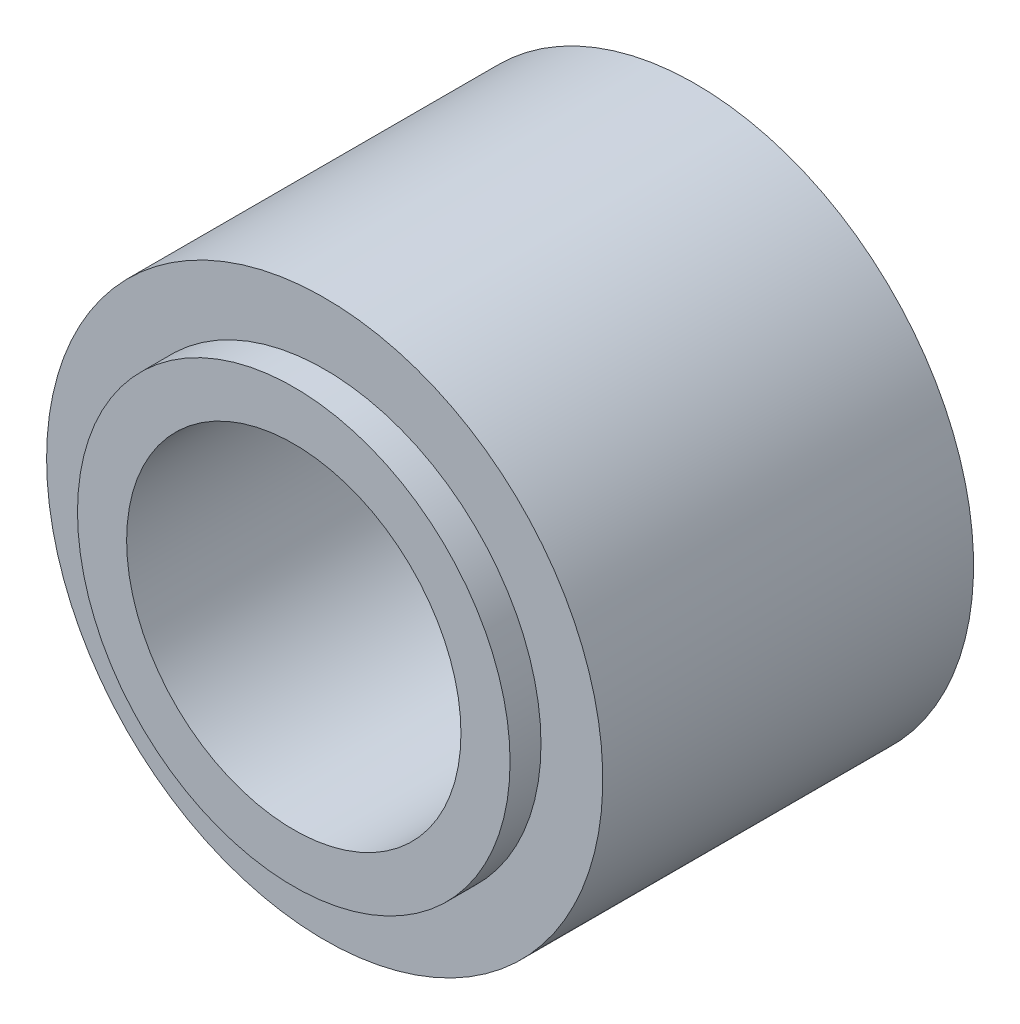
ISO-10303-21;
HEADER;
FILE_DESCRIPTION(('STEP AP214'),'2;1');
FILE_NAME('part.step','',(''),(''),'','','');
FILE_SCHEMA(('AUTOMOTIVE_DESIGN { 1 0 10303 214 1 1 1 1 }'));
ENDSEC;
DATA;
#1=APPLICATION_CONTEXT('core data for automotive mechanical design processes');
#2=APPLICATION_PROTOCOL_DEFINITION('international standard','automotive_design',2000,#1);
#3=PRODUCT_CONTEXT('',#1,'mechanical');
#4=PRODUCT('Part','Part','',(#3));
#5=PRODUCT_RELATED_PRODUCT_CATEGORY('part','',(#4));
#6=PRODUCT_DEFINITION_FORMATION('','',#4);
#7=PRODUCT_DEFINITION_CONTEXT('part definition',#1,'design');
#8=PRODUCT_DEFINITION('design','',#6,#7);
#9=PRODUCT_DEFINITION_SHAPE('','',#8);
#10=(LENGTH_UNIT() NAMED_UNIT(*) SI_UNIT(.MILLI.,.METRE.));
#11=(NAMED_UNIT(*) PLANE_ANGLE_UNIT() SI_UNIT($,.RADIAN.));
#12=(NAMED_UNIT(*) SI_UNIT($,.STERADIAN.) SOLID_ANGLE_UNIT());
#13=UNCERTAINTY_MEASURE_WITH_UNIT(LENGTH_MEASURE(1.E-05),#10,'distance_accuracy_value','');
#14=(GEOMETRIC_REPRESENTATION_CONTEXT(3) GLOBAL_UNCERTAINTY_ASSIGNED_CONTEXT((#13)) GLOBAL_UNIT_ASSIGNED_CONTEXT((#10,
#11,#12)) REPRESENTATION_CONTEXT('',''));
#15=CARTESIAN_POINT('',(0.,0.,0.));
#16=DIRECTION('',(0.,0.,1.));
#17=DIRECTION('',(1.,0.,0.));
#18=AXIS2_PLACEMENT_3D('',#15,#16,#17);
#19=CARTESIAN_POINT('',(0.,0.,0.));
#20=DIRECTION('',(0.,0.,-1.));
#21=DIRECTION('',(-1.,0.,0.));
#22=AXIS2_PLACEMENT_3D('',#19,#20,#21);
#23=PLANE('',#22);
#24=CARTESIAN_POINT('',(0.,0.,0.));
#25=DIRECTION('',(0.,0.,-1.));
#26=DIRECTION('',(-1.,0.,0.));
#27=AXIS2_PLACEMENT_3D('',#24,#25,#26);
#28=CIRCLE('',#27,2.7051);
#29=CARTESIAN_POINT('',(-2.7051,0.,0.));
#30=VERTEX_POINT('',#29);
#31=EDGE_CURVE('E49',#30,#30,#28,.T.);
#32=ORIENTED_EDGE('',*,*,#31,.F.);
#33=EDGE_LOOP('',(#32));
#34=FACE_BOUND('',#33,.T.);
#35=CARTESIAN_POINT('',(0.,0.,0.));
#36=DIRECTION('',(0.,0.,-1.));
#37=DIRECTION('',(-1.,0.,0.));
#38=AXIS2_PLACEMENT_3D('',#35,#36,#37);
#39=CIRCLE('',#38,4.5);
#40=CARTESIAN_POINT('',(-4.5,0.,0.));
#41=VERTEX_POINT('',#40);
#42=EDGE_CURVE('E10',#41,#41,#39,.T.);
#43=ORIENTED_EDGE('',*,*,#42,.T.);
#44=EDGE_LOOP('',(#43));
#45=FACE_BOUND('',#44,.T.);
#46=ADVANCED_FACE('F30',(#34,#45),#23,.T.);
#47=CARTESIAN_POINT('',(0.,0.,0.));
#48=DIRECTION('',(0.,0.,-1.));
#49=DIRECTION('',(-1.,0.,0.));
#50=AXIS2_PLACEMENT_3D('',#47,#48,#49);
#51=CYLINDRICAL_SURFACE('',#50,4.5);
#52=CARTESIAN_POINT('',(0.,0.,6.));
#53=DIRECTION('',(0.,0.,-1.));
#54=DIRECTION('',(-1.,0.,0.));
#55=AXIS2_PLACEMENT_3D('',#52,#53,#54);
#56=CIRCLE('',#55,4.5);
#57=CARTESIAN_POINT('',(-4.5,0.,6.));
#58=VERTEX_POINT('',#57);
#59=EDGE_CURVE('E37',#58,#58,#56,.T.);
#60=ORIENTED_EDGE('',*,*,#59,.T.);
#61=EDGE_LOOP('',(#60));
#62=FACE_BOUND('',#61,.T.);
#63=ORIENTED_EDGE('',*,*,#42,.F.);
#64=EDGE_LOOP('',(#63));
#65=FACE_BOUND('',#64,.T.);
#66=ADVANCED_FACE('F73',(#62,#65),#51,.T.);
#67=CARTESIAN_POINT('',(0.,4.5,6.));
#68=DIRECTION('',(0.,0.,1.));
#69=DIRECTION('',(1.,0.,0.));
#70=AXIS2_PLACEMENT_3D('',#67,#68,#69);
#71=PLANE('',#70);
#72=CARTESIAN_POINT('',(0.,0.,6.));
#73=DIRECTION('',(0.,0.,-1.));
#74=DIRECTION('',(-1.,0.,0.));
#75=AXIS2_PLACEMENT_3D('',#72,#73,#74);
#76=CIRCLE('',#75,3.5);
#77=CARTESIAN_POINT('',(-3.5,0.,6.));
#78=VERTEX_POINT('',#77);
#79=EDGE_CURVE('E41',#78,#78,#76,.T.);
#80=ORIENTED_EDGE('',*,*,#79,.T.);
#81=EDGE_LOOP('',(#80));
#82=FACE_BOUND('',#81,.T.);
#83=ORIENTED_EDGE('',*,*,#59,.F.);
#84=EDGE_LOOP('',(#83));
#85=FACE_BOUND('',#84,.T.);
#86=ADVANCED_FACE('F67',(#82,#85),#71,.T.);
#87=CARTESIAN_POINT('',(0.,0.,0.));
#88=DIRECTION('',(0.,0.,-1.));
#89=DIRECTION('',(-1.,0.,0.));
#90=AXIS2_PLACEMENT_3D('',#87,#88,#89);
#91=CYLINDRICAL_SURFACE('',#90,3.5);
#92=CARTESIAN_POINT('',(0.,0.,6.5));
#93=DIRECTION('',(0.,0.,-1.));
#94=DIRECTION('',(-1.,0.,0.));
#95=AXIS2_PLACEMENT_3D('',#92,#93,#94);
#96=CIRCLE('',#95,3.5);
#97=CARTESIAN_POINT('',(-3.5,0.,6.5));
#98=VERTEX_POINT('',#97);
#99=EDGE_CURVE('E46',#98,#98,#96,.T.);
#100=ORIENTED_EDGE('',*,*,#99,.T.);
#101=EDGE_LOOP('',(#100));
#102=FACE_BOUND('',#101,.T.);
#103=ORIENTED_EDGE('',*,*,#79,.F.);
#104=EDGE_LOOP('',(#103));
#105=FACE_BOUND('',#104,.T.);
#106=ADVANCED_FACE('F61',(#102,#105),#91,.T.);
#107=CARTESIAN_POINT('',(0.,3.5,6.5));
#108=DIRECTION('',(0.,0.,1.));
#109=DIRECTION('',(1.,0.,0.));
#110=AXIS2_PLACEMENT_3D('',#107,#108,#109);
#111=PLANE('',#110);
#112=CARTESIAN_POINT('',(0.,0.,6.5));
#113=DIRECTION('',(0.,0.,1.));
#114=DIRECTION('',(1.,0.,0.));
#115=AXIS2_PLACEMENT_3D('',#112,#113,#114);
#116=CIRCLE('',#115,2.7051);
#117=CARTESIAN_POINT('',(2.7051,0.,6.5));
#118=VERTEX_POINT('',#117);
#119=EDGE_CURVE('E33',#118,#118,#116,.T.);
#120=ORIENTED_EDGE('',*,*,#119,.F.);
#121=EDGE_LOOP('',(#120));
#122=FACE_BOUND('',#121,.T.);
#123=ORIENTED_EDGE('',*,*,#99,.F.);
#124=EDGE_LOOP('',(#123));
#125=FACE_BOUND('',#124,.T.);
#126=ADVANCED_FACE('F58',(#122,#125),#111,.T.);
#127=CARTESIAN_POINT('',(0.,0.,0.));
#128=DIRECTION('',(0.,0.,-1.));
#129=DIRECTION('',(-1.,0.,0.));
#130=AXIS2_PLACEMENT_3D('',#127,#128,#129);
#131=CYLINDRICAL_SURFACE('',#130,2.7051);
#132=ORIENTED_EDGE('',*,*,#119,.T.);
#133=EDGE_LOOP('',(#132));
#134=FACE_BOUND('',#133,.T.);
#135=ORIENTED_EDGE('',*,*,#31,.T.);
#136=EDGE_LOOP('',(#135));
#137=FACE_BOUND('',#136,.T.);
#138=ADVANCED_FACE('F56',(#134,#137),#131,.F.);
#139=CLOSED_SHELL('',(#46,#66,#86,#106,#126,#138));
#140=MANIFOLD_SOLID_BREP('B2',#139);
#141=ADVANCED_BREP_SHAPE_REPRESENTATION('',(#18,#140),#14);
#142=SHAPE_DEFINITION_REPRESENTATION(#9,#141);
ENDSEC;
END-ISO-10303-21;
